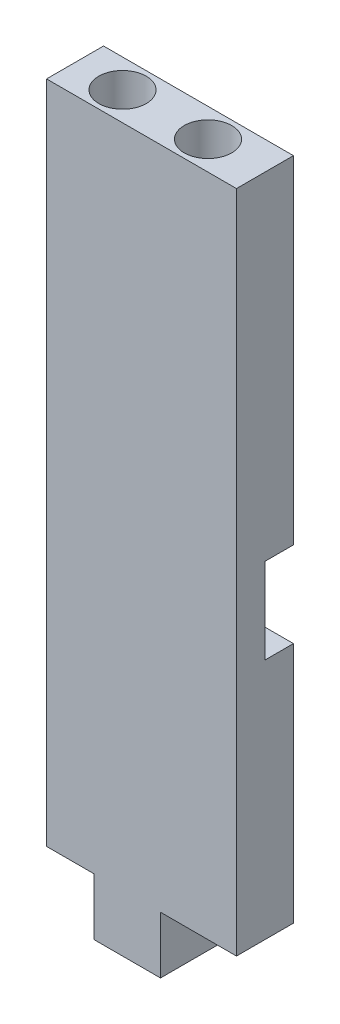
ISO-10303-21;
HEADER;
FILE_DESCRIPTION(('STEP AP214'),'2;1');
FILE_NAME('part.step','',(''),(''),'','','');
FILE_SCHEMA(('AUTOMOTIVE_DESIGN { 1 0 10303 214 1 1 1 1 }'));
ENDSEC;
DATA;
#1=APPLICATION_CONTEXT('core data for automotive mechanical design processes');
#2=APPLICATION_PROTOCOL_DEFINITION('international standard','automotive_design',2000,#1);
#3=PRODUCT_CONTEXT('',#1,'mechanical');
#4=PRODUCT('Part','Part','',(#3));
#5=PRODUCT_RELATED_PRODUCT_CATEGORY('part','',(#4));
#6=PRODUCT_DEFINITION_FORMATION('','',#4);
#7=PRODUCT_DEFINITION_CONTEXT('part definition',#1,'design');
#8=PRODUCT_DEFINITION('design','',#6,#7);
#9=PRODUCT_DEFINITION_SHAPE('','',#8);
#10=(LENGTH_UNIT() NAMED_UNIT(*) SI_UNIT(.MILLI.,.METRE.));
#11=(NAMED_UNIT(*) PLANE_ANGLE_UNIT() SI_UNIT($,.RADIAN.));
#12=(NAMED_UNIT(*) SI_UNIT($,.STERADIAN.) SOLID_ANGLE_UNIT());
#13=UNCERTAINTY_MEASURE_WITH_UNIT(LENGTH_MEASURE(1.E-05),#10,'distance_accuracy_value','');
#14=(GEOMETRIC_REPRESENTATION_CONTEXT(3) GLOBAL_UNCERTAINTY_ASSIGNED_CONTEXT((#13)) GLOBAL_UNIT_ASSIGNED_CONTEXT((#10,
#11,#12)) REPRESENTATION_CONTEXT('',''));
#15=CARTESIAN_POINT('',(0.,0.,0.));
#16=DIRECTION('',(0.,0.,1.));
#17=DIRECTION('',(1.,0.,0.));
#18=AXIS2_PLACEMENT_3D('',#15,#16,#17);
#19=CARTESIAN_POINT('',(0.,0.,6.));
#20=DIRECTION('',(0.,1.,0.));
#21=DIRECTION('',(0.,0.,1.));
#22=AXIS2_PLACEMENT_3D('',#19,#20,#21);
#23=PLANE('',#22);
#24=DIRECTION('',(0.,0.,1.));
#25=VECTOR('',#24,1.);
#26=CARTESIAN_POINT('',(11.99999999999,0.,-3.57960189267814E-12));
#27=LINE('',#26,#25);
#28=CARTESIAN_POINT('',(11.99999999999,0.,0.));
#29=VERTEX_POINT('',#28);
#30=CARTESIAN_POINT('',(11.99999999999,0.,6.));
#31=VERTEX_POINT('',#30);
#32=EDGE_CURVE('E170',#29,#31,#27,.T.);
#33=ORIENTED_EDGE('',*,*,#32,.F.);
#34=DIRECTION('',(1.,0.,0.));
#35=VECTOR('',#34,1.);
#36=CARTESIAN_POINT('',(0.,0.,0.));
#37=LINE('',#36,#35);
#38=CARTESIAN_POINT('',(20.,0.,0.));
#39=VERTEX_POINT('',#38);
#40=EDGE_CURVE('E248',#29,#39,#37,.T.);
#41=ORIENTED_EDGE('',*,*,#40,.T.);
#42=DIRECTION('',(0.,0.,-1.));
#43=VECTOR('',#42,1.);
#44=CARTESIAN_POINT('',(20.,0.,6.));
#45=LINE('',#44,#43);
#46=CARTESIAN_POINT('',(20.,0.,6.));
#47=VERTEX_POINT('',#46);
#48=EDGE_CURVE('E43',#47,#39,#45,.T.);
#49=ORIENTED_EDGE('',*,*,#48,.F.);
#50=DIRECTION('',(1.,0.,0.));
#51=VECTOR('',#50,1.);
#52=CARTESIAN_POINT('',(0.,0.,6.));
#53=LINE('',#52,#51);
#54=EDGE_CURVE('E50',#31,#47,#53,.T.);
#55=ORIENTED_EDGE('',*,*,#54,.F.);
#56=EDGE_LOOP('',(#33,#41,#49,#55));
#57=FACE_BOUND('',#56,.T.);
#58=ADVANCED_FACE('F35',(#57),#23,.F.);
#59=DIRECTION('',(0.,0.,-1.));
#60=VECTOR('',#59,1.);
#61=CARTESIAN_POINT('',(4.99999999999001,0.,-3.67848113080882E-12));
#62=LINE('',#61,#60);
#63=CARTESIAN_POINT('',(4.99999999999001,0.,6.));
#64=VERTEX_POINT('',#63);
#65=CARTESIAN_POINT('',(4.99999999999001,0.,-3.67848113080882E-12));
#66=VERTEX_POINT('',#65);
#67=EDGE_CURVE('E58',#64,#66,#62,.T.);
#68=ORIENTED_EDGE('',*,*,#67,.F.);
#69=CARTESIAN_POINT('',(0.,0.,6.));
#70=VERTEX_POINT('',#69);
#71=EDGE_CURVE('E238',#70,#64,#53,.T.);
#72=ORIENTED_EDGE('',*,*,#71,.F.);
#73=DIRECTION('',(0.,0.,-1.));
#74=VECTOR('',#73,1.);
#75=CARTESIAN_POINT('',(0.,0.,6.));
#76=LINE('',#75,#74);
#77=CARTESIAN_POINT('',(0.,0.,0.));
#78=VERTEX_POINT('',#77);
#79=EDGE_CURVE('E11',#70,#78,#76,.T.);
#80=ORIENTED_EDGE('',*,*,#79,.T.);
#81=EDGE_CURVE('E249',#78,#66,#37,.T.);
#82=ORIENTED_EDGE('',*,*,#81,.T.);
#83=EDGE_LOOP('',(#68,#72,#80,#82));
#84=FACE_BOUND('',#83,.T.);
#85=ADVANCED_FACE('F295',(#84),#23,.F.);
#86=CARTESIAN_POINT('',(0.,0.,6.));
#87=DIRECTION('',(1.,0.,0.));
#88=DIRECTION('',(0.,0.,-1.));
#89=AXIS2_PLACEMENT_3D('',#86,#87,#88);
#90=PLANE('',#89);
#91=DIRECTION('',(0.,1.,0.));
#92=VECTOR('',#91,1.);
#93=CARTESIAN_POINT('',(0.,25.500000000011,3.));
#94=LINE('',#93,#92);
#95=CARTESIAN_POINT('',(0.,25.500000000011,3.));
#96=VERTEX_POINT('',#95);
#97=CARTESIAN_POINT('',(0.,34.500000000011,3.));
#98=VERTEX_POINT('',#97);
#99=EDGE_CURVE('E206',#96,#98,#94,.T.);
#100=ORIENTED_EDGE('',*,*,#99,.F.);
#101=DIRECTION('',(0.,0.,-1.));
#102=VECTOR('',#101,1.);
#103=CARTESIAN_POINT('',(0.,25.500000000011,3.));
#104=LINE('',#103,#102);
#105=CARTESIAN_POINT('',(0.,25.500000000011,0.));
#106=VERTEX_POINT('',#105);
#107=EDGE_CURVE('E226',#96,#106,#104,.T.);
#108=ORIENTED_EDGE('',*,*,#107,.T.);
#109=DIRECTION('',(0.,-1.,0.));
#110=VECTOR('',#109,1.);
#111=CARTESIAN_POINT('',(0.,0.,0.));
#112=LINE('',#111,#110);
#113=EDGE_CURVE('E229',#106,#78,#112,.T.);
#114=ORIENTED_EDGE('',*,*,#113,.T.);
#115=ORIENTED_EDGE('',*,*,#79,.F.);
#116=DIRECTION('',(0.,-1.,0.));
#117=VECTOR('',#116,1.);
#118=CARTESIAN_POINT('',(0.,0.,6.));
#119=LINE('',#118,#117);
#120=CARTESIAN_POINT('',(0.,70.,6.));
#121=VERTEX_POINT('',#120);
#122=EDGE_CURVE('E235',#121,#70,#119,.T.);
#123=ORIENTED_EDGE('',*,*,#122,.F.);
#124=DIRECTION('',(0.,0.,-1.));
#125=VECTOR('',#124,1.);
#126=CARTESIAN_POINT('',(0.,70.,6.));
#127=LINE('',#126,#125);
#128=CARTESIAN_POINT('',(0.,70.,0.));
#129=VERTEX_POINT('',#128);
#130=EDGE_CURVE('E244',#121,#129,#127,.T.);
#131=ORIENTED_EDGE('',*,*,#130,.T.);
#132=CARTESIAN_POINT('',(0.,34.500000000011,0.));
#133=VERTEX_POINT('',#132);
#134=EDGE_CURVE('E245',#129,#133,#112,.T.);
#135=ORIENTED_EDGE('',*,*,#134,.T.);
#136=DIRECTION('',(0.,0.,-1.));
#137=VECTOR('',#136,1.);
#138=CARTESIAN_POINT('',(0.,34.500000000011,3.));
#139=LINE('',#138,#137);
#140=EDGE_CURVE('E219',#98,#133,#139,.T.);
#141=ORIENTED_EDGE('',*,*,#140,.F.);
#142=EDGE_LOOP('',(#100,#108,#114,#115,#123,#131,#135,#141));
#143=FACE_BOUND('',#142,.T.);
#144=ADVANCED_FACE('F37',(#143),#90,.F.);
#145=CARTESIAN_POINT('',(20.,0.,6.));
#146=DIRECTION('',(-1.,0.,0.));
#147=DIRECTION('',(0.,0.,1.));
#148=AXIS2_PLACEMENT_3D('',#145,#146,#147);
#149=PLANE('',#148);
#150=DIRECTION('',(0.,-1.,0.));
#151=VECTOR('',#150,1.);
#152=CARTESIAN_POINT('',(20.,25.500000000011,3.));
#153=LINE('',#152,#151);
#154=CARTESIAN_POINT('',(20.,34.500000000011,3.));
#155=VERTEX_POINT('',#154);
#156=CARTESIAN_POINT('',(20.,25.500000000011,3.));
#157=VERTEX_POINT('',#156);
#158=EDGE_CURVE('E180',#155,#157,#153,.T.);
#159=ORIENTED_EDGE('',*,*,#158,.F.);
#160=DIRECTION('',(0.,0.,-1.));
#161=VECTOR('',#160,1.);
#162=CARTESIAN_POINT('',(20.,34.500000000011,3.));
#163=LINE('',#162,#161);
#164=CARTESIAN_POINT('',(20.,34.500000000011,0.));
#165=VERTEX_POINT('',#164);
#166=EDGE_CURVE('E197',#155,#165,#163,.T.);
#167=ORIENTED_EDGE('',*,*,#166,.T.);
#168=DIRECTION('',(0.,1.,0.));
#169=VECTOR('',#168,1.);
#170=CARTESIAN_POINT('',(20.,0.,0.));
#171=LINE('',#170,#169);
#172=CARTESIAN_POINT('',(20.,70.,0.));
#173=VERTEX_POINT('',#172);
#174=EDGE_CURVE('E251',#165,#173,#171,.T.);
#175=ORIENTED_EDGE('',*,*,#174,.T.);
#176=DIRECTION('',(0.,0.,-1.));
#177=VECTOR('',#176,1.);
#178=CARTESIAN_POINT('',(20.,70.,6.));
#179=LINE('',#178,#177);
#180=CARTESIAN_POINT('',(20.,70.,6.));
#181=VERTEX_POINT('',#180);
#182=EDGE_CURVE('E258',#181,#173,#179,.T.);
#183=ORIENTED_EDGE('',*,*,#182,.F.);
#184=DIRECTION('',(0.,1.,0.));
#185=VECTOR('',#184,1.);
#186=CARTESIAN_POINT('',(20.,0.,6.));
#187=LINE('',#186,#185);
#188=EDGE_CURVE('E240',#47,#181,#187,.T.);
#189=ORIENTED_EDGE('',*,*,#188,.F.);
#190=ORIENTED_EDGE('',*,*,#48,.T.);
#191=CARTESIAN_POINT('',(20.,25.500000000011,0.));
#192=VERTEX_POINT('',#191);
#193=EDGE_CURVE('E252',#39,#192,#171,.T.);
#194=ORIENTED_EDGE('',*,*,#193,.T.);
#195=DIRECTION('',(0.,0.,-1.));
#196=VECTOR('',#195,1.);
#197=CARTESIAN_POINT('',(20.,25.500000000011,3.));
#198=LINE('',#197,#196);
#199=EDGE_CURVE('E192',#157,#192,#198,.T.);
#200=ORIENTED_EDGE('',*,*,#199,.F.);
#201=EDGE_LOOP('',(#159,#167,#175,#183,#189,#190,#194,#200));
#202=FACE_BOUND('',#201,.T.);
#203=ADVANCED_FACE('F265',(#202),#149,.F.);
#204=CARTESIAN_POINT('',(0.,70.,6.));
#205=DIRECTION('',(0.,-1.,0.));
#206=DIRECTION('',(0.,0.,-1.));
#207=AXIS2_PLACEMENT_3D('',#204,#205,#206);
#208=PLANE('',#207);
#209=CARTESIAN_POINT('',(14.,70.,3.));
#210=DIRECTION('',(0.,1.,0.));
#211=DIRECTION('',(0.,0.,1.));
#212=AXIS2_PLACEMENT_3D('',#209,#210,#211);
#213=CIRCLE('',#212,2.5);
#214=CARTESIAN_POINT('',(14.,70.,5.5));
#215=VERTEX_POINT('',#214);
#216=EDGE_CURVE('E314',#215,#215,#213,.T.);
#217=ORIENTED_EDGE('',*,*,#216,.F.);
#218=EDGE_LOOP('',(#217));
#219=FACE_BOUND('',#218,.T.);
#220=CARTESIAN_POINT('',(5.,70.,3.));
#221=DIRECTION('',(0.,1.,0.));
#222=DIRECTION('',(0.,0.,1.));
#223=AXIS2_PLACEMENT_3D('',#220,#221,#222);
#224=CIRCLE('',#223,2.5);
#225=CARTESIAN_POINT('',(5.,70.,5.5));
#226=VERTEX_POINT('',#225);
#227=EDGE_CURVE('E308',#226,#226,#224,.T.);
#228=ORIENTED_EDGE('',*,*,#227,.F.);
#229=EDGE_LOOP('',(#228));
#230=FACE_BOUND('',#229,.T.);
#231=DIRECTION('',(-1.,0.,0.));
#232=VECTOR('',#231,1.);
#233=CARTESIAN_POINT('',(0.,70.,0.));
#234=LINE('',#233,#232);
#235=EDGE_CURVE('E237',#173,#129,#234,.T.);
#236=ORIENTED_EDGE('',*,*,#235,.T.);
#237=ORIENTED_EDGE('',*,*,#130,.F.);
#238=DIRECTION('',(-1.,0.,0.));
#239=VECTOR('',#238,1.);
#240=CARTESIAN_POINT('',(0.,70.,6.));
#241=LINE('',#240,#239);
#242=EDGE_CURVE('E242',#181,#121,#241,.T.);
#243=ORIENTED_EDGE('',*,*,#242,.F.);
#244=ORIENTED_EDGE('',*,*,#182,.T.);
#245=EDGE_LOOP('',(#236,#237,#243,#244));
#246=FACE_BOUND('',#245,.T.);
#247=ADVANCED_FACE('F287',(#219,#230,#246),#208,.F.);
#248=CARTESIAN_POINT('',(0.,0.,6.));
#249=DIRECTION('',(0.,0.,-1.));
#250=DIRECTION('',(-1.,0.,0.));
#251=AXIS2_PLACEMENT_3D('',#248,#249,#250);
#252=PLANE('',#251);
#253=ORIENTED_EDGE('',*,*,#122,.T.);
#254=ORIENTED_EDGE('',*,*,#71,.T.);
#255=DIRECTION('',(0.,1.,0.));
#256=VECTOR('',#255,1.);
#257=CARTESIAN_POINT('',(4.99999999999001,-6.,6.));
#258=LINE('',#257,#256);
#259=CARTESIAN_POINT('',(4.99999999999001,-6.,6.));
#260=VERTEX_POINT('',#259);
#261=EDGE_CURVE('E155',#260,#64,#258,.T.);
#262=ORIENTED_EDGE('',*,*,#261,.F.);
#263=DIRECTION('',(-1.,0.,0.));
#264=VECTOR('',#263,1.);
#265=CARTESIAN_POINT('',(11.99999999999,-6.,6.));
#266=LINE('',#265,#264);
#267=CARTESIAN_POINT('',(11.99999999999,-6.,6.));
#268=VERTEX_POINT('',#267);
#269=EDGE_CURVE('E147',#268,#260,#266,.T.);
#270=ORIENTED_EDGE('',*,*,#269,.F.);
#271=DIRECTION('',(0.,1.,0.));
#272=VECTOR('',#271,1.);
#273=CARTESIAN_POINT('',(11.99999999999,-6.,6.));
#274=LINE('',#273,#272);
#275=EDGE_CURVE('E152',#268,#31,#274,.T.);
#276=ORIENTED_EDGE('',*,*,#275,.T.);
#277=ORIENTED_EDGE('',*,*,#54,.T.);
#278=ORIENTED_EDGE('',*,*,#188,.T.);
#279=ORIENTED_EDGE('',*,*,#242,.T.);
#280=EDGE_LOOP('',(#253,#254,#262,#270,#276,#277,#278,#279));
#281=FACE_BOUND('',#280,.T.);
#282=ADVANCED_FACE('F150',(#281),#252,.F.);
#283=CARTESIAN_POINT('',(0.,0.,0.));
#284=DIRECTION('',(0.,0.,-1.));
#285=DIRECTION('',(-1.,0.,0.));
#286=AXIS2_PLACEMENT_3D('',#283,#284,#285);
#287=PLANE('',#286);
#288=DIRECTION('',(1.,0.,0.));
#289=VECTOR('',#288,1.);
#290=CARTESIAN_POINT('',(20.,34.500000000011,0.));
#291=LINE('',#290,#289);
#292=CARTESIAN_POINT('',(12.9999999999902,34.500000000011,0.));
#293=VERTEX_POINT('',#292);
#294=EDGE_CURVE('E184',#293,#165,#291,.T.);
#295=ORIENTED_EDGE('',*,*,#294,.F.);
#296=DIRECTION('',(0.,1.,0.));
#297=VECTOR('',#296,1.);
#298=CARTESIAN_POINT('',(12.9999999999902,25.500000000011,0.));
#299=LINE('',#298,#297);
#300=CARTESIAN_POINT('',(12.9999999999902,25.500000000011,0.));
#301=VERTEX_POINT('',#300);
#302=EDGE_CURVE('E174',#301,#293,#299,.T.);
#303=ORIENTED_EDGE('',*,*,#302,.F.);
#304=DIRECTION('',(-1.,0.,0.));
#305=VECTOR('',#304,1.);
#306=CARTESIAN_POINT('',(20.,25.500000000011,0.));
#307=LINE('',#306,#305);
#308=EDGE_CURVE('E171',#192,#301,#307,.T.);
#309=ORIENTED_EDGE('',*,*,#308,.F.);
#310=ORIENTED_EDGE('',*,*,#193,.F.);
#311=ORIENTED_EDGE('',*,*,#40,.F.);
#312=DIRECTION('',(0.,1.,0.));
#313=VECTOR('',#312,1.);
#314=CARTESIAN_POINT('',(11.99999999999,-6.,-3.57960189267814E-12));
#315=LINE('',#314,#313);
#316=CARTESIAN_POINT('',(11.99999999999,-6.,-3.57960189267814E-12));
#317=VERTEX_POINT('',#316);
#318=EDGE_CURVE('E301',#317,#29,#315,.T.);
#319=ORIENTED_EDGE('',*,*,#318,.F.);
#320=DIRECTION('',(1.,0.,0.));
#321=VECTOR('',#320,1.);
#322=CARTESIAN_POINT('',(11.99999999999,-6.,-3.57960189267814E-12));
#323=LINE('',#322,#321);
#324=CARTESIAN_POINT('',(4.99999999999001,-6.,-3.67848113080882E-12));
#325=VERTEX_POINT('',#324);
#326=EDGE_CURVE('E164',#325,#317,#323,.T.);
#327=ORIENTED_EDGE('',*,*,#326,.F.);
#328=DIRECTION('',(0.,1.,0.));
#329=VECTOR('',#328,1.);
#330=CARTESIAN_POINT('',(4.99999999999001,-6.,-3.67848113080882E-12));
#331=LINE('',#330,#329);
#332=EDGE_CURVE('E176',#325,#66,#331,.T.);
#333=ORIENTED_EDGE('',*,*,#332,.T.);
#334=ORIENTED_EDGE('',*,*,#81,.F.);
#335=ORIENTED_EDGE('',*,*,#113,.F.);
#336=DIRECTION('',(-1.,0.,0.));
#337=VECTOR('',#336,1.);
#338=CARTESIAN_POINT('',(0.,25.500000000011,0.));
#339=LINE('',#338,#337);
#340=CARTESIAN_POINT('',(7.99999999999025,25.500000000011,0.));
#341=VERTEX_POINT('',#340);
#342=EDGE_CURVE('E210',#341,#106,#339,.T.);
#343=ORIENTED_EDGE('',*,*,#342,.F.);
#344=DIRECTION('',(0.,-1.,0.));
#345=VECTOR('',#344,1.);
#346=CARTESIAN_POINT('',(7.99999999999025,25.500000000011,0.));
#347=LINE('',#346,#345);
#348=CARTESIAN_POINT('',(7.99999999999025,34.500000000011,0.));
#349=VERTEX_POINT('',#348);
#350=EDGE_CURVE('E222',#349,#341,#347,.T.);
#351=ORIENTED_EDGE('',*,*,#350,.F.);
#352=DIRECTION('',(1.,0.,0.));
#353=VECTOR('',#352,1.);
#354=CARTESIAN_POINT('',(0.,34.500000000011,0.));
#355=LINE('',#354,#353);
#356=EDGE_CURVE('E200',#133,#349,#355,.T.);
#357=ORIENTED_EDGE('',*,*,#356,.F.);
#358=ORIENTED_EDGE('',*,*,#134,.F.);
#359=ORIENTED_EDGE('',*,*,#235,.F.);
#360=ORIENTED_EDGE('',*,*,#174,.F.);
#361=EDGE_LOOP('',(#295,#303,#309,#310,#311,#319,#327,#333,#334,#335,#343,#351,#357,#358,#359,#360));
#362=FACE_BOUND('',#361,.T.);
#363=ADVANCED_FACE('F272',(#362),#287,.T.);
#364=CARTESIAN_POINT('',(0.,25.500000000011,3.));
#365=DIRECTION('',(0.,-1.,0.));
#366=DIRECTION('',(1.,0.,0.));
#367=AXIS2_PLACEMENT_3D('',#364,#365,#366);
#368=PLANE('',#367);
#369=ORIENTED_EDGE('',*,*,#342,.T.);
#370=ORIENTED_EDGE('',*,*,#107,.F.);
#371=DIRECTION('',(-1.,0.,0.));
#372=VECTOR('',#371,1.);
#373=CARTESIAN_POINT('',(0.,25.500000000011,3.));
#374=LINE('',#373,#372);
#375=CARTESIAN_POINT('',(7.99999999999025,25.500000000011,3.));
#376=VERTEX_POINT('',#375);
#377=EDGE_CURVE('E216',#376,#96,#374,.T.);
#378=ORIENTED_EDGE('',*,*,#377,.F.);
#379=DIRECTION('',(0.,0.,-1.));
#380=VECTOR('',#379,1.);
#381=CARTESIAN_POINT('',(7.99999999999025,25.500000000011,3.));
#382=LINE('',#381,#380);
#383=EDGE_CURVE('E230',#376,#341,#382,.T.);
#384=ORIENTED_EDGE('',*,*,#383,.T.);
#385=EDGE_LOOP('',(#369,#370,#378,#384));
#386=FACE_BOUND('',#385,.T.);
#387=ADVANCED_FACE('F355',(#386),#368,.F.);
#388=CARTESIAN_POINT('',(7.99999999999025,25.500000000011,3.));
#389=DIRECTION('',(1.,0.,0.));
#390=DIRECTION('',(0.,0.,-1.));
#391=AXIS2_PLACEMENT_3D('',#388,#389,#390);
#392=PLANE('',#391);
#393=ORIENTED_EDGE('',*,*,#350,.T.);
#394=ORIENTED_EDGE('',*,*,#383,.F.);
#395=DIRECTION('',(0.,-1.,0.));
#396=VECTOR('',#395,1.);
#397=CARTESIAN_POINT('',(7.99999999999025,25.500000000011,3.));
#398=LINE('',#397,#396);
#399=CARTESIAN_POINT('',(7.99999999999025,34.500000000011,3.));
#400=VERTEX_POINT('',#399);
#401=EDGE_CURVE('E213',#400,#376,#398,.T.);
#402=ORIENTED_EDGE('',*,*,#401,.F.);
#403=DIRECTION('',(0.,0.,-1.));
#404=VECTOR('',#403,1.);
#405=CARTESIAN_POINT('',(7.99999999999025,34.500000000011,3.));
#406=LINE('',#405,#404);
#407=EDGE_CURVE('E232',#400,#349,#406,.T.);
#408=ORIENTED_EDGE('',*,*,#407,.T.);
#409=EDGE_LOOP('',(#393,#394,#402,#408));
#410=FACE_BOUND('',#409,.T.);
#411=ADVANCED_FACE('F362',(#410),#392,.F.);
#412=CARTESIAN_POINT('',(0.,34.500000000011,3.));
#413=DIRECTION('',(0.,1.,0.));
#414=DIRECTION('',(0.,0.,1.));
#415=AXIS2_PLACEMENT_3D('',#412,#413,#414);
#416=PLANE('',#415);
#417=ORIENTED_EDGE('',*,*,#356,.T.);
#418=ORIENTED_EDGE('',*,*,#407,.F.);
#419=DIRECTION('',(1.,0.,0.));
#420=VECTOR('',#419,1.);
#421=CARTESIAN_POINT('',(0.,34.500000000011,3.));
#422=LINE('',#421,#420);
#423=EDGE_CURVE('E209',#98,#400,#422,.T.);
#424=ORIENTED_EDGE('',*,*,#423,.F.);
#425=ORIENTED_EDGE('',*,*,#140,.T.);
#426=EDGE_LOOP('',(#417,#418,#424,#425));
#427=FACE_BOUND('',#426,.T.);
#428=ADVANCED_FACE('F358',(#427),#416,.F.);
#429=CARTESIAN_POINT('',(0.,0.,3.));
#430=DIRECTION('',(0.,0.,-1.));
#431=DIRECTION('',(-1.,0.,0.));
#432=AXIS2_PLACEMENT_3D('',#429,#430,#431);
#433=PLANE('',#432);
#434=ORIENTED_EDGE('',*,*,#99,.T.);
#435=ORIENTED_EDGE('',*,*,#423,.T.);
#436=ORIENTED_EDGE('',*,*,#401,.T.);
#437=ORIENTED_EDGE('',*,*,#377,.T.);
#438=EDGE_LOOP('',(#434,#435,#436,#437));
#439=FACE_BOUND('',#438,.T.);
#440=ADVANCED_FACE('F361',(#439),#433,.T.);
#441=CARTESIAN_POINT('',(20.,34.500000000011,3.));
#442=DIRECTION('',(0.,1.,0.));
#443=DIRECTION('',(0.,0.,1.));
#444=AXIS2_PLACEMENT_3D('',#441,#442,#443);
#445=PLANE('',#444);
#446=ORIENTED_EDGE('',*,*,#294,.T.);
#447=ORIENTED_EDGE('',*,*,#166,.F.);
#448=DIRECTION('',(1.,0.,0.));
#449=VECTOR('',#448,1.);
#450=CARTESIAN_POINT('',(20.,34.500000000011,3.));
#451=LINE('',#450,#449);
#452=CARTESIAN_POINT('',(12.9999999999902,34.500000000011,3.));
#453=VERTEX_POINT('',#452);
#454=EDGE_CURVE('E190',#453,#155,#451,.T.);
#455=ORIENTED_EDGE('',*,*,#454,.F.);
#456=DIRECTION('',(0.,0.,-1.));
#457=VECTOR('',#456,1.);
#458=CARTESIAN_POINT('',(12.9999999999902,34.500000000011,3.));
#459=LINE('',#458,#457);
#460=EDGE_CURVE('E201',#453,#293,#459,.T.);
#461=ORIENTED_EDGE('',*,*,#460,.T.);
#462=EDGE_LOOP('',(#446,#447,#455,#461));
#463=FACE_BOUND('',#462,.T.);
#464=ADVANCED_FACE('F282',(#463),#445,.F.);
#465=CARTESIAN_POINT('',(12.9999999999902,25.500000000011,3.));
#466=DIRECTION('',(-1.,0.,0.));
#467=DIRECTION('',(0.,0.,1.));
#468=AXIS2_PLACEMENT_3D('',#465,#466,#467);
#469=PLANE('',#468);
#470=ORIENTED_EDGE('',*,*,#302,.T.);
#471=ORIENTED_EDGE('',*,*,#460,.F.);
#472=DIRECTION('',(0.,1.,0.));
#473=VECTOR('',#472,1.);
#474=CARTESIAN_POINT('',(12.9999999999902,25.500000000011,3.));
#475=LINE('',#474,#473);
#476=CARTESIAN_POINT('',(12.9999999999902,25.500000000011,3.));
#477=VERTEX_POINT('',#476);
#478=EDGE_CURVE('E187',#477,#453,#475,.T.);
#479=ORIENTED_EDGE('',*,*,#478,.F.);
#480=DIRECTION('',(0.,0.,-1.));
#481=VECTOR('',#480,1.);
#482=CARTESIAN_POINT('',(12.9999999999902,25.500000000011,3.));
#483=LINE('',#482,#481);
#484=EDGE_CURVE('E203',#477,#301,#483,.T.);
#485=ORIENTED_EDGE('',*,*,#484,.T.);
#486=EDGE_LOOP('',(#470,#471,#479,#485));
#487=FACE_BOUND('',#486,.T.);
#488=ADVANCED_FACE('F375',(#487),#469,.F.);
#489=CARTESIAN_POINT('',(20.,25.500000000011,3.));
#490=DIRECTION('',(0.,-1.,0.));
#491=DIRECTION('',(0.,0.,-1.));
#492=AXIS2_PLACEMENT_3D('',#489,#490,#491);
#493=PLANE('',#492);
#494=ORIENTED_EDGE('',*,*,#308,.T.);
#495=ORIENTED_EDGE('',*,*,#484,.F.);
#496=DIRECTION('',(-1.,0.,0.));
#497=VECTOR('',#496,1.);
#498=CARTESIAN_POINT('',(20.,25.500000000011,3.));
#499=LINE('',#498,#497);
#500=EDGE_CURVE('E183',#157,#477,#499,.T.);
#501=ORIENTED_EDGE('',*,*,#500,.F.);
#502=ORIENTED_EDGE('',*,*,#199,.T.);
#503=EDGE_LOOP('',(#494,#495,#501,#502));
#504=FACE_BOUND('',#503,.T.);
#505=ADVANCED_FACE('F275',(#504),#493,.F.);
#506=CARTESIAN_POINT('',(0.,0.,3.));
#507=DIRECTION('',(0.,0.,1.));
#508=DIRECTION('',(1.,0.,0.));
#509=AXIS2_PLACEMENT_3D('',#506,#507,#508);
#510=PLANE('',#509);
#511=ORIENTED_EDGE('',*,*,#158,.T.);
#512=ORIENTED_EDGE('',*,*,#500,.T.);
#513=ORIENTED_EDGE('',*,*,#478,.T.);
#514=ORIENTED_EDGE('',*,*,#454,.T.);
#515=EDGE_LOOP('',(#511,#512,#513,#514));
#516=FACE_BOUND('',#515,.T.);
#517=ADVANCED_FACE('F279',(#516),#510,.F.);
#518=CARTESIAN_POINT('',(11.99999999999,-6.,-3.57960189267814E-12));
#519=DIRECTION('',(-1.,0.,0.));
#520=DIRECTION('',(0.,0.,1.));
#521=AXIS2_PLACEMENT_3D('',#518,#519,#520);
#522=PLANE('',#521);
#523=ORIENTED_EDGE('',*,*,#32,.T.);
#524=ORIENTED_EDGE('',*,*,#275,.F.);
#525=DIRECTION('',(0.,0.,1.));
#526=VECTOR('',#525,1.);
#527=CARTESIAN_POINT('',(11.99999999999,-6.,-3.57960189267814E-12));
#528=LINE('',#527,#526);
#529=EDGE_CURVE('E159',#317,#268,#528,.T.);
#530=ORIENTED_EDGE('',*,*,#529,.F.);
#531=ORIENTED_EDGE('',*,*,#318,.T.);
#532=EDGE_LOOP('',(#523,#524,#530,#531));
#533=FACE_BOUND('',#532,.T.);
#534=ADVANCED_FACE('F169',(#533),#522,.F.);
#535=CARTESIAN_POINT('',(4.99999999999001,-6.,-3.67848113080882E-12));
#536=DIRECTION('',(1.,0.,0.));
#537=DIRECTION('',(0.,0.,-1.));
#538=AXIS2_PLACEMENT_3D('',#535,#536,#537);
#539=PLANE('',#538);
#540=ORIENTED_EDGE('',*,*,#67,.T.);
#541=ORIENTED_EDGE('',*,*,#332,.F.);
#542=DIRECTION('',(0.,0.,-1.));
#543=VECTOR('',#542,1.);
#544=CARTESIAN_POINT('',(4.99999999999001,-6.,-3.67848113080882E-12));
#545=LINE('',#544,#543);
#546=EDGE_CURVE('E158',#260,#325,#545,.T.);
#547=ORIENTED_EDGE('',*,*,#546,.F.);
#548=ORIENTED_EDGE('',*,*,#261,.T.);
#549=EDGE_LOOP('',(#540,#541,#547,#548));
#550=FACE_BOUND('',#549,.T.);
#551=ADVANCED_FACE('F299',(#550),#539,.F.);
#552=CARTESIAN_POINT('',(0.,-6.,0.));
#553=DIRECTION('',(0.,-1.,0.));
#554=DIRECTION('',(0.,0.,-1.));
#555=AXIS2_PLACEMENT_3D('',#552,#553,#554);
#556=PLANE('',#555);
#557=ORIENTED_EDGE('',*,*,#529,.T.);
#558=ORIENTED_EDGE('',*,*,#269,.T.);
#559=ORIENTED_EDGE('',*,*,#546,.T.);
#560=ORIENTED_EDGE('',*,*,#326,.T.);
#561=EDGE_LOOP('',(#557,#558,#559,#560));
#562=FACE_BOUND('',#561,.T.);
#563=ADVANCED_FACE('F162',(#562),#556,.T.);
#564=CARTESIAN_POINT('',(5.,60.,3.));
#565=DIRECTION('',(0.,1.,0.));
#566=DIRECTION('',(0.,0.,1.));
#567=AXIS2_PLACEMENT_3D('',#564,#565,#566);
#568=CYLINDRICAL_SURFACE('',#567,2.5);
#569=CARTESIAN_POINT('',(5.,60.,3.));
#570=DIRECTION('',(0.,1.,0.));
#571=DIRECTION('',(0.,0.,1.));
#572=AXIS2_PLACEMENT_3D('',#569,#570,#571);
#573=CIRCLE('',#572,2.5);
#574=CARTESIAN_POINT('',(5.,60.,5.5));
#575=VERTEX_POINT('',#574);
#576=EDGE_CURVE('E305',#575,#575,#573,.T.);
#577=ORIENTED_EDGE('',*,*,#576,.F.);
#578=EDGE_LOOP('',(#577));
#579=FACE_BOUND('',#578,.T.);
#580=ORIENTED_EDGE('',*,*,#227,.T.);
#581=EDGE_LOOP('',(#580));
#582=FACE_BOUND('',#581,.T.);
#583=ADVANCED_FACE('F334',(#579,#582),#568,.F.);
#584=CARTESIAN_POINT('',(5.,60.,3.));
#585=DIRECTION('',(0.,1.,0.));
#586=DIRECTION('',(0.,0.,1.));
#587=AXIS2_PLACEMENT_3D('',#584,#585,#586);
#588=PLANE('',#587);
#589=ORIENTED_EDGE('',*,*,#576,.T.);
#590=EDGE_LOOP('',(#589));
#591=FACE_BOUND('',#590,.T.);
#592=ADVANCED_FACE('F325',(#591),#588,.T.);
#593=CARTESIAN_POINT('',(14.,60.,3.));
#594=DIRECTION('',(0.,1.,0.));
#595=DIRECTION('',(0.,0.,1.));
#596=AXIS2_PLACEMENT_3D('',#593,#594,#595);
#597=CYLINDRICAL_SURFACE('',#596,2.5);
#598=CARTESIAN_POINT('',(14.,60.,3.));
#599=DIRECTION('',(0.,1.,0.));
#600=DIRECTION('',(0.,0.,1.));
#601=AXIS2_PLACEMENT_3D('',#598,#599,#600);
#602=CIRCLE('',#601,2.5);
#603=CARTESIAN_POINT('',(14.,60.,5.5));
#604=VERTEX_POINT('',#603);
#605=EDGE_CURVE('E311',#604,#604,#602,.T.);
#606=ORIENTED_EDGE('',*,*,#605,.F.);
#607=EDGE_LOOP('',(#606));
#608=FACE_BOUND('',#607,.T.);
#609=ORIENTED_EDGE('',*,*,#216,.T.);
#610=EDGE_LOOP('',(#609));
#611=FACE_BOUND('',#610,.T.);
#612=ADVANCED_FACE('F322',(#608,#611),#597,.F.);
#613=CARTESIAN_POINT('',(14.,60.,3.));
#614=DIRECTION('',(0.,1.,0.));
#615=DIRECTION('',(0.,0.,1.));
#616=AXIS2_PLACEMENT_3D('',#613,#614,#615);
#617=PLANE('',#616);
#618=ORIENTED_EDGE('',*,*,#605,.T.);
#619=EDGE_LOOP('',(#618));
#620=FACE_BOUND('',#619,.T.);
#621=ADVANCED_FACE('F320',(#620),#617,.T.);
#622=CLOSED_SHELL('',(#58,#85,#144,#203,#247,#282,#363,#387,#411,#428,#440,#464,#488,#505,#517,
#534,#551,#563,#583,#592,#612,#621));
#623=MANIFOLD_SOLID_BREP('B2',#622);
#624=ADVANCED_BREP_SHAPE_REPRESENTATION('',(#18,#623),#14);
#625=SHAPE_DEFINITION_REPRESENTATION(#9,#624);
ENDSEC;
END-ISO-10303-21;
